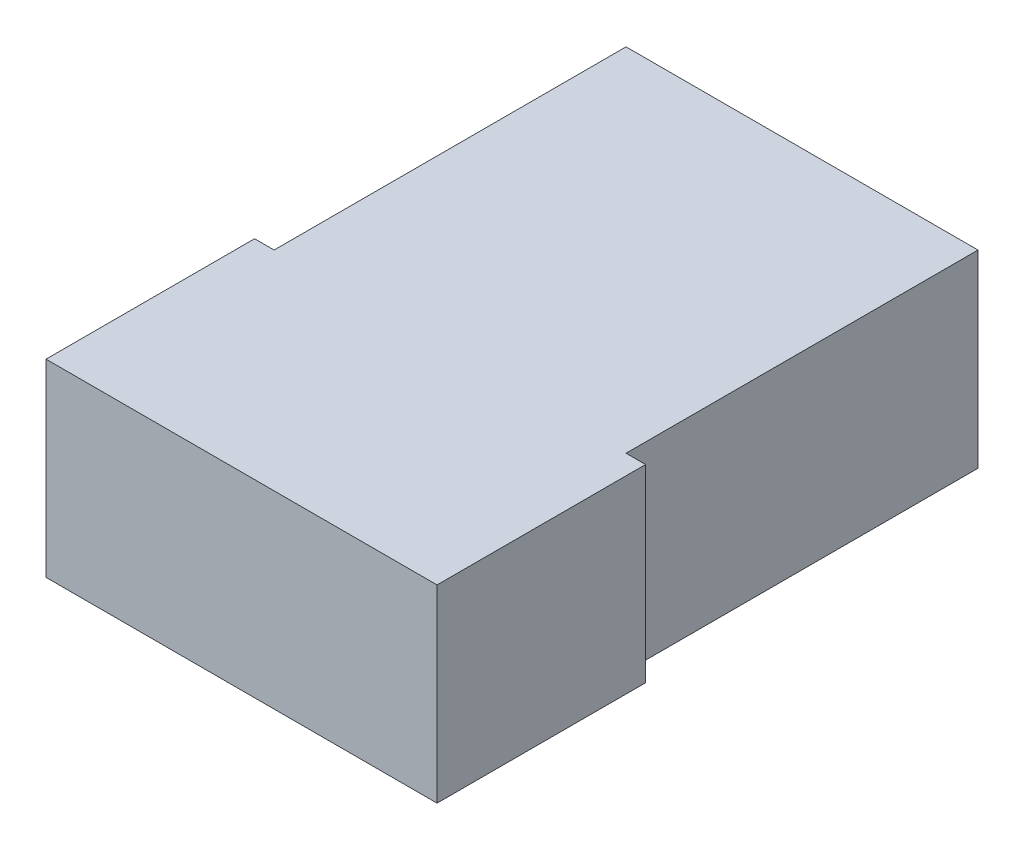
ISO-10303-21;
HEADER;
FILE_DESCRIPTION(('STEP AP214'),'2;1');
FILE_NAME('part.step','',(''),(''),'','','');
FILE_SCHEMA(('AUTOMOTIVE_DESIGN { 1 0 10303 214 1 1 1 1 }'));
ENDSEC;
DATA;
#1=APPLICATION_CONTEXT('core data for automotive mechanical design processes');
#2=APPLICATION_PROTOCOL_DEFINITION('international standard','automotive_design',2000,#1);
#3=PRODUCT_CONTEXT('',#1,'mechanical');
#4=PRODUCT('Part','Part','',(#3));
#5=PRODUCT_RELATED_PRODUCT_CATEGORY('part','',(#4));
#6=PRODUCT_DEFINITION_FORMATION('','',#4);
#7=PRODUCT_DEFINITION_CONTEXT('part definition',#1,'design');
#8=PRODUCT_DEFINITION('design','',#6,#7);
#9=PRODUCT_DEFINITION_SHAPE('','',#8);
#10=(LENGTH_UNIT() NAMED_UNIT(*) SI_UNIT(.MILLI.,.METRE.));
#11=(NAMED_UNIT(*) PLANE_ANGLE_UNIT() SI_UNIT($,.RADIAN.));
#12=(NAMED_UNIT(*) SI_UNIT($,.STERADIAN.) SOLID_ANGLE_UNIT());
#13=UNCERTAINTY_MEASURE_WITH_UNIT(LENGTH_MEASURE(1.E-05),#10,'distance_accuracy_value','');
#14=(GEOMETRIC_REPRESENTATION_CONTEXT(3) GLOBAL_UNCERTAINTY_ASSIGNED_CONTEXT((#13)) GLOBAL_UNIT_ASSIGNED_CONTEXT((#10,
#11,#12)) REPRESENTATION_CONTEXT('',''));
#15=CARTESIAN_POINT('',(0.,0.,0.));
#16=DIRECTION('',(0.,0.,1.));
#17=DIRECTION('',(1.,0.,0.));
#18=AXIS2_PLACEMENT_3D('',#15,#16,#17);
#19=CARTESIAN_POINT('',(0.,48.,0.));
#20=DIRECTION('',(0.,-1.,0.));
#21=DIRECTION('',(0.,0.,-1.));
#22=AXIS2_PLACEMENT_3D('',#19,#20,#21);
#23=PLANE('',#22);
#24=DIRECTION('',(0.,0.,-1.));
#25=VECTOR('',#24,1.);
#26=CARTESIAN_POINT('',(13.5,48.,13.5));
#27=LINE('',#26,#25);
#28=CARTESIAN_POINT('',(13.5,48.,13.5));
#29=VERTEX_POINT('',#28);
#30=CARTESIAN_POINT('',(13.5,48.,-13.5));
#31=VERTEX_POINT('',#30);
#32=EDGE_CURVE('E297',#29,#31,#27,.T.);
#33=ORIENTED_EDGE('',*,*,#32,.F.);
#34=DIRECTION('',(-1.,0.,0.));
#35=VECTOR('',#34,1.);
#36=CARTESIAN_POINT('',(15.,48.,13.5));
#37=LINE('',#36,#35);
#38=CARTESIAN_POINT('',(15.,48.,13.5));
#39=VERTEX_POINT('',#38);
#40=EDGE_CURVE('E272',#39,#29,#37,.T.);
#41=ORIENTED_EDGE('',*,*,#40,.F.);
#42=DIRECTION('',(0.,0.,-1.));
#43=VECTOR('',#42,1.);
#44=CARTESIAN_POINT('',(15.,48.,29.5));
#45=LINE('',#44,#43);
#46=CARTESIAN_POINT('',(15.,48.,29.5));
#47=VERTEX_POINT('',#46);
#48=EDGE_CURVE('E281',#47,#39,#45,.T.);
#49=ORIENTED_EDGE('',*,*,#48,.F.);
#50=DIRECTION('',(1.,0.,0.));
#51=VECTOR('',#50,1.);
#52=CARTESIAN_POINT('',(-15.,48.,29.5));
#53=LINE('',#52,#51);
#54=CARTESIAN_POINT('',(-15.,48.,29.5));
#55=VERTEX_POINT('',#54);
#56=EDGE_CURVE('E285',#55,#47,#53,.T.);
#57=ORIENTED_EDGE('',*,*,#56,.F.);
#58=DIRECTION('',(0.,0.,1.));
#59=VECTOR('',#58,1.);
#60=CARTESIAN_POINT('',(-15.,48.,13.5));
#61=LINE('',#60,#59);
#62=CARTESIAN_POINT('',(-15.,48.,13.5));
#63=VERTEX_POINT('',#62);
#64=EDGE_CURVE('E267',#63,#55,#61,.T.);
#65=ORIENTED_EDGE('',*,*,#64,.F.);
#66=CARTESIAN_POINT('',(-13.5,48.,13.5));
#67=VERTEX_POINT('',#66);
#68=EDGE_CURVE('E287',#67,#63,#37,.T.);
#69=ORIENTED_EDGE('',*,*,#68,.F.);
#70=DIRECTION('',(0.,0.,1.));
#71=VECTOR('',#70,1.);
#72=CARTESIAN_POINT('',(-13.5,48.,13.5));
#73=LINE('',#72,#71);
#74=CARTESIAN_POINT('',(-13.5,48.,-13.5));
#75=VERTEX_POINT('',#74);
#76=EDGE_CURVE('E304',#75,#67,#73,.T.);
#77=ORIENTED_EDGE('',*,*,#76,.F.);
#78=DIRECTION('',(-1.,0.,0.));
#79=VECTOR('',#78,1.);
#80=CARTESIAN_POINT('',(-13.5,48.,-13.5));
#81=LINE('',#80,#79);
#82=EDGE_CURVE('E315',#31,#75,#81,.T.);
#83=ORIENTED_EDGE('',*,*,#82,.F.);
#84=EDGE_LOOP('',(#33,#41,#49,#57,#65,#69,#77,#83));
#85=FACE_BOUND('',#84,.T.);
#86=DIRECTION('',(-1.,0.,0.));
#87=VECTOR('',#86,1.);
#88=CARTESIAN_POINT('',(11.7,48.,-11.7));
#89=LINE('',#88,#87);
#90=CARTESIAN_POINT('',(11.7,48.,-11.7));
#91=VERTEX_POINT('',#90);
#92=CARTESIAN_POINT('',(-11.7,48.,-11.7));
#93=VERTEX_POINT('',#92);
#94=EDGE_CURVE('E239',#91,#93,#89,.T.);
#95=ORIENTED_EDGE('',*,*,#94,.T.);
#96=DIRECTION('',(0.,0.,1.));
#97=VECTOR('',#96,1.);
#98=CARTESIAN_POINT('',(-11.7,48.,-11.7));
#99=LINE('',#98,#97);
#100=CARTESIAN_POINT('',(-11.7,48.,11.7));
#101=VERTEX_POINT('',#100);
#102=EDGE_CURVE('E232',#93,#101,#99,.T.);
#103=ORIENTED_EDGE('',*,*,#102,.T.);
#104=DIRECTION('',(1.,0.,0.));
#105=VECTOR('',#104,1.);
#106=CARTESIAN_POINT('',(-11.7,48.,11.7));
#107=LINE('',#106,#105);
#108=CARTESIAN_POINT('',(11.7,48.,11.7));
#109=VERTEX_POINT('',#108);
#110=EDGE_CURVE('E248',#101,#109,#107,.T.);
#111=ORIENTED_EDGE('',*,*,#110,.T.);
#112=DIRECTION('',(0.,0.,-1.));
#113=VECTOR('',#112,1.);
#114=CARTESIAN_POINT('',(11.7,48.,11.7));
#115=LINE('',#114,#113);
#116=EDGE_CURVE('E255',#109,#91,#115,.T.);
#117=ORIENTED_EDGE('',*,*,#116,.T.);
#118=EDGE_LOOP('',(#95,#103,#111,#117));
#119=FACE_BOUND('',#118,.T.);
#120=DIRECTION('',(1.,0.,0.));
#121=VECTOR('',#120,1.);
#122=CARTESIAN_POINT('',(-13.7,48.,28.7));
#123=LINE('',#122,#121);
#124=CARTESIAN_POINT('',(-13.7,48.,28.7));
#125=VERTEX_POINT('',#124);
#126=CARTESIAN_POINT('',(13.7,48.,28.7));
#127=VERTEX_POINT('',#126);
#128=EDGE_CURVE('E197',#125,#127,#123,.T.);
#129=ORIENTED_EDGE('',*,*,#128,.T.);
#130=DIRECTION('',(0.,0.,-1.));
#131=VECTOR('',#130,1.);
#132=CARTESIAN_POINT('',(13.7,48.,28.7));
#133=LINE('',#132,#131);
#134=CARTESIAN_POINT('',(13.7,48.,14.3));
#135=VERTEX_POINT('',#134);
#136=EDGE_CURVE('E59',#127,#135,#133,.T.);
#137=ORIENTED_EDGE('',*,*,#136,.T.);
#138=DIRECTION('',(-1.,0.,0.));
#139=VECTOR('',#138,1.);
#140=CARTESIAN_POINT('',(-13.7,48.,14.3));
#141=LINE('',#140,#139);
#142=CARTESIAN_POINT('',(-13.7,48.,14.3));
#143=VERTEX_POINT('',#142);
#144=EDGE_CURVE('E198',#135,#143,#141,.T.);
#145=ORIENTED_EDGE('',*,*,#144,.T.);
#146=DIRECTION('',(0.,0.,1.));
#147=VECTOR('',#146,1.);
#148=CARTESIAN_POINT('',(-13.7,48.,28.7));
#149=LINE('',#148,#147);
#150=EDGE_CURVE('E578',#143,#125,#149,.T.);
#151=ORIENTED_EDGE('',*,*,#150,.T.);
#152=EDGE_LOOP('',(#129,#137,#145,#151));
#153=FACE_BOUND('',#152,.T.);
#154=ADVANCED_FACE('F43',(#85,#119,#153),#23,.T.);
#155=CARTESIAN_POINT('',(13.5,62.5,13.5));
#156=DIRECTION('',(-1.,0.,0.));
#157=DIRECTION('',(0.,0.,1.));
#158=AXIS2_PLACEMENT_3D('',#155,#156,#157);
#159=PLANE('',#158);
#160=ORIENTED_EDGE('',*,*,#32,.T.);
#161=DIRECTION('',(0.,-1.,0.));
#162=VECTOR('',#161,1.);
#163=CARTESIAN_POINT('',(13.5,62.5,-13.5));
#164=LINE('',#163,#162);
#165=CARTESIAN_POINT('',(13.5,62.5,-13.5));
#166=VERTEX_POINT('',#165);
#167=EDGE_CURVE('E11',#166,#31,#164,.T.);
#168=ORIENTED_EDGE('',*,*,#167,.F.);
#169=DIRECTION('',(0.,0.,-1.));
#170=VECTOR('',#169,1.);
#171=CARTESIAN_POINT('',(13.5,62.5,13.5));
#172=LINE('',#171,#170);
#173=CARTESIAN_POINT('',(13.5,62.5,13.5));
#174=VERTEX_POINT('',#173);
#175=EDGE_CURVE('E301',#174,#166,#172,.T.);
#176=ORIENTED_EDGE('',*,*,#175,.F.);
#177=DIRECTION('',(0.,-1.,0.));
#178=VECTOR('',#177,1.);
#179=CARTESIAN_POINT('',(13.5,62.5,13.5));
#180=LINE('',#179,#178);
#181=EDGE_CURVE('E307',#174,#29,#180,.T.);
#182=ORIENTED_EDGE('',*,*,#181,.T.);
#183=EDGE_LOOP('',(#160,#168,#176,#182));
#184=FACE_BOUND('',#183,.T.);
#185=ADVANCED_FACE('F44',(#184),#159,.F.);
#186=CARTESIAN_POINT('',(-13.5,62.5,-13.5));
#187=DIRECTION('',(0.,0.,1.));
#188=DIRECTION('',(1.,0.,0.));
#189=AXIS2_PLACEMENT_3D('',#186,#187,#188);
#190=PLANE('',#189);
#191=ORIENTED_EDGE('',*,*,#82,.T.);
#192=DIRECTION('',(0.,-1.,0.));
#193=VECTOR('',#192,1.);
#194=CARTESIAN_POINT('',(-13.5,62.5,-13.5));
#195=LINE('',#194,#193);
#196=CARTESIAN_POINT('',(-13.5,62.5,-13.5));
#197=VERTEX_POINT('',#196);
#198=EDGE_CURVE('E51',#197,#75,#195,.T.);
#199=ORIENTED_EDGE('',*,*,#198,.F.);
#200=DIRECTION('',(-1.,0.,0.));
#201=VECTOR('',#200,1.);
#202=CARTESIAN_POINT('',(-13.5,62.5,-13.5));
#203=LINE('',#202,#201);
#204=EDGE_CURVE('E302',#166,#197,#203,.T.);
#205=ORIENTED_EDGE('',*,*,#204,.F.);
#206=ORIENTED_EDGE('',*,*,#167,.T.);
#207=EDGE_LOOP('',(#191,#199,#205,#206));
#208=FACE_BOUND('',#207,.T.);
#209=ADVANCED_FACE('F344',(#208),#190,.F.);
#210=CARTESIAN_POINT('',(-13.5,62.5,13.5));
#211=DIRECTION('',(1.,0.,0.));
#212=DIRECTION('',(0.,0.,-1.));
#213=AXIS2_PLACEMENT_3D('',#210,#211,#212);
#214=PLANE('',#213);
#215=ORIENTED_EDGE('',*,*,#76,.T.);
#216=DIRECTION('',(0.,-1.,0.));
#217=VECTOR('',#216,1.);
#218=CARTESIAN_POINT('',(-13.5,62.5,13.5));
#219=LINE('',#218,#217);
#220=CARTESIAN_POINT('',(-13.5,62.5,13.5));
#221=VERTEX_POINT('',#220);
#222=EDGE_CURVE('E317',#221,#67,#219,.T.);
#223=ORIENTED_EDGE('',*,*,#222,.F.);
#224=DIRECTION('',(0.,0.,1.));
#225=VECTOR('',#224,1.);
#226=CARTESIAN_POINT('',(-13.5,62.5,13.5));
#227=LINE('',#226,#225);
#228=EDGE_CURVE('E310',#197,#221,#227,.T.);
#229=ORIENTED_EDGE('',*,*,#228,.F.);
#230=ORIENTED_EDGE('',*,*,#198,.T.);
#231=EDGE_LOOP('',(#215,#223,#229,#230));
#232=FACE_BOUND('',#231,.T.);
#233=ADVANCED_FACE('F324',(#232),#214,.F.);
#234=CARTESIAN_POINT('',(0.,62.5,0.));
#235=DIRECTION('',(0.,-1.,0.));
#236=DIRECTION('',(0.,0.,-1.));
#237=AXIS2_PLACEMENT_3D('',#234,#235,#236);
#238=PLANE('',#237);
#239=ORIENTED_EDGE('',*,*,#175,.T.);
#240=ORIENTED_EDGE('',*,*,#204,.T.);
#241=ORIENTED_EDGE('',*,*,#228,.T.);
#242=DIRECTION('',(-1.,0.,0.));
#243=VECTOR('',#242,1.);
#244=CARTESIAN_POINT('',(15.,62.5,13.5));
#245=LINE('',#244,#243);
#246=CARTESIAN_POINT('',(-15.,62.5,13.5));
#247=VERTEX_POINT('',#246);
#248=EDGE_CURVE('E273',#221,#247,#245,.T.);
#249=ORIENTED_EDGE('',*,*,#248,.T.);
#250=DIRECTION('',(0.,0.,1.));
#251=VECTOR('',#250,1.);
#252=CARTESIAN_POINT('',(-15.,62.5,13.5));
#253=LINE('',#252,#251);
#254=CARTESIAN_POINT('',(-15.,62.5,29.5));
#255=VERTEX_POINT('',#254);
#256=EDGE_CURVE('E270',#247,#255,#253,.T.);
#257=ORIENTED_EDGE('',*,*,#256,.T.);
#258=DIRECTION('',(1.,0.,0.));
#259=VECTOR('',#258,1.);
#260=CARTESIAN_POINT('',(-15.,62.5,29.5));
#261=LINE('',#260,#259);
#262=CARTESIAN_POINT('',(15.,62.5,29.5));
#263=VERTEX_POINT('',#262);
#264=EDGE_CURVE('E266',#255,#263,#261,.T.);
#265=ORIENTED_EDGE('',*,*,#264,.T.);
#266=DIRECTION('',(0.,0.,-1.));
#267=VECTOR('',#266,1.);
#268=CARTESIAN_POINT('',(15.,62.5,29.5));
#269=LINE('',#268,#267);
#270=CARTESIAN_POINT('',(15.,62.5,13.5));
#271=VERTEX_POINT('',#270);
#272=EDGE_CURVE('E271',#263,#271,#269,.T.);
#273=ORIENTED_EDGE('',*,*,#272,.T.);
#274=EDGE_CURVE('E277',#271,#174,#245,.T.);
#275=ORIENTED_EDGE('',*,*,#274,.T.);
#276=EDGE_LOOP('',(#239,#240,#241,#249,#257,#265,#273,#275));
#277=FACE_BOUND('',#276,.T.);
#278=ADVANCED_FACE('F338',(#277),#238,.F.);
#279=CARTESIAN_POINT('',(15.,62.5,13.5));
#280=DIRECTION('',(0.,0.,1.));
#281=DIRECTION('',(1.,0.,0.));
#282=AXIS2_PLACEMENT_3D('',#279,#280,#281);
#283=PLANE('',#282);
#284=ORIENTED_EDGE('',*,*,#248,.F.);
#285=ORIENTED_EDGE('',*,*,#222,.T.);
#286=ORIENTED_EDGE('',*,*,#68,.T.);
#287=DIRECTION('',(0.,-1.,0.));
#288=VECTOR('',#287,1.);
#289=CARTESIAN_POINT('',(-15.,62.5,13.5));
#290=LINE('',#289,#288);
#291=EDGE_CURVE('E276',#247,#63,#290,.T.);
#292=ORIENTED_EDGE('',*,*,#291,.F.);
#293=EDGE_LOOP('',(#284,#285,#286,#292));
#294=FACE_BOUND('',#293,.T.);
#295=ADVANCED_FACE('F334',(#294),#283,.F.);
#296=CARTESIAN_POINT('',(-15.,62.5,13.5));
#297=DIRECTION('',(1.,0.,0.));
#298=DIRECTION('',(0.,0.,-1.));
#299=AXIS2_PLACEMENT_3D('',#296,#297,#298);
#300=PLANE('',#299);
#301=ORIENTED_EDGE('',*,*,#64,.T.);
#302=DIRECTION('',(0.,-1.,0.));
#303=VECTOR('',#302,1.);
#304=CARTESIAN_POINT('',(-15.,62.5,29.5));
#305=LINE('',#304,#303);
#306=EDGE_CURVE('E300',#255,#55,#305,.T.);
#307=ORIENTED_EDGE('',*,*,#306,.F.);
#308=ORIENTED_EDGE('',*,*,#256,.F.);
#309=ORIENTED_EDGE('',*,*,#291,.T.);
#310=EDGE_LOOP('',(#301,#307,#308,#309));
#311=FACE_BOUND('',#310,.T.);
#312=ADVANCED_FACE('F340',(#311),#300,.F.);
#313=CARTESIAN_POINT('',(-15.,62.5,29.5));
#314=DIRECTION('',(0.,0.,-1.));
#315=DIRECTION('',(-1.,0.,0.));
#316=AXIS2_PLACEMENT_3D('',#313,#314,#315);
#317=PLANE('',#316);
#318=ORIENTED_EDGE('',*,*,#56,.T.);
#319=DIRECTION('',(0.,-1.,0.));
#320=VECTOR('',#319,1.);
#321=CARTESIAN_POINT('',(15.,62.5,29.5));
#322=LINE('',#321,#320);
#323=EDGE_CURVE('E295',#263,#47,#322,.T.);
#324=ORIENTED_EDGE('',*,*,#323,.F.);
#325=ORIENTED_EDGE('',*,*,#264,.F.);
#326=ORIENTED_EDGE('',*,*,#306,.T.);
#327=EDGE_LOOP('',(#318,#324,#325,#326));
#328=FACE_BOUND('',#327,.T.);
#329=ADVANCED_FACE('F358',(#328),#317,.F.);
#330=CARTESIAN_POINT('',(15.,62.5,29.5));
#331=DIRECTION('',(-1.,0.,0.));
#332=DIRECTION('',(0.,0.,1.));
#333=AXIS2_PLACEMENT_3D('',#330,#331,#332);
#334=PLANE('',#333);
#335=ORIENTED_EDGE('',*,*,#48,.T.);
#336=DIRECTION('',(0.,-1.,0.));
#337=VECTOR('',#336,1.);
#338=CARTESIAN_POINT('',(15.,62.5,13.5));
#339=LINE('',#338,#337);
#340=EDGE_CURVE('E293',#271,#39,#339,.T.);
#341=ORIENTED_EDGE('',*,*,#340,.F.);
#342=ORIENTED_EDGE('',*,*,#272,.F.);
#343=ORIENTED_EDGE('',*,*,#323,.T.);
#344=EDGE_LOOP('',(#335,#341,#342,#343));
#345=FACE_BOUND('',#344,.T.);
#346=ADVANCED_FACE('F354',(#345),#334,.F.);
#347=ORIENTED_EDGE('',*,*,#181,.F.);
#348=ORIENTED_EDGE('',*,*,#274,.F.);
#349=ORIENTED_EDGE('',*,*,#340,.T.);
#350=ORIENTED_EDGE('',*,*,#40,.T.);
#351=EDGE_LOOP('',(#347,#348,#349,#350));
#352=FACE_BOUND('',#351,.T.);
#353=ADVANCED_FACE('F346',(#352),#283,.F.);
#354=CARTESIAN_POINT('',(-11.7,54.,-11.7));
#355=DIRECTION('',(1.,0.,0.));
#356=DIRECTION('',(0.,0.,-1.));
#357=AXIS2_PLACEMENT_3D('',#354,#355,#356);
#358=PLANE('',#357);
#359=ORIENTED_EDGE('',*,*,#102,.F.);
#360=DIRECTION('',(0.,-1.,0.));
#361=VECTOR('',#360,1.);
#362=CARTESIAN_POINT('',(-11.7,54.,-11.7));
#363=LINE('',#362,#361);
#364=CARTESIAN_POINT('',(-11.7,54.,-11.7));
#365=VERTEX_POINT('',#364);
#366=EDGE_CURVE('E246',#365,#93,#363,.T.);
#367=ORIENTED_EDGE('',*,*,#366,.F.);
#368=DIRECTION('',(0.,0.,1.));
#369=VECTOR('',#368,1.);
#370=CARTESIAN_POINT('',(-11.7,54.,-11.7));
#371=LINE('',#370,#369);
#372=CARTESIAN_POINT('',(-11.7,54.,11.7));
#373=VERTEX_POINT('',#372);
#374=EDGE_CURVE('E236',#365,#373,#371,.T.);
#375=ORIENTED_EDGE('',*,*,#374,.T.);
#376=DIRECTION('',(0.,-1.,0.));
#377=VECTOR('',#376,1.);
#378=CARTESIAN_POINT('',(-11.7,54.,11.7));
#379=LINE('',#378,#377);
#380=EDGE_CURVE('E264',#373,#101,#379,.T.);
#381=ORIENTED_EDGE('',*,*,#380,.T.);
#382=EDGE_LOOP('',(#359,#367,#375,#381));
#383=FACE_BOUND('',#382,.T.);
#384=ADVANCED_FACE('F428',(#383),#358,.T.);
#385=CARTESIAN_POINT('',(-11.7,54.,11.7));
#386=DIRECTION('',(0.,0.,-1.));
#387=DIRECTION('',(-1.,0.,0.));
#388=AXIS2_PLACEMENT_3D('',#385,#386,#387);
#389=PLANE('',#388);
#390=ORIENTED_EDGE('',*,*,#110,.F.);
#391=ORIENTED_EDGE('',*,*,#380,.F.);
#392=DIRECTION('',(1.,0.,0.));
#393=VECTOR('',#392,1.);
#394=CARTESIAN_POINT('',(-11.7,54.,11.7));
#395=LINE('',#394,#393);
#396=CARTESIAN_POINT('',(11.7,54.,11.7));
#397=VERTEX_POINT('',#396);
#398=EDGE_CURVE('E237',#373,#397,#395,.T.);
#399=ORIENTED_EDGE('',*,*,#398,.T.);
#400=DIRECTION('',(0.,-1.,0.));
#401=VECTOR('',#400,1.);
#402=CARTESIAN_POINT('',(11.7,54.,11.7));
#403=LINE('',#402,#401);
#404=EDGE_CURVE('E262',#397,#109,#403,.T.);
#405=ORIENTED_EDGE('',*,*,#404,.T.);
#406=EDGE_LOOP('',(#390,#391,#399,#405));
#407=FACE_BOUND('',#406,.T.);
#408=ADVANCED_FACE('F432',(#407),#389,.T.);
#409=CARTESIAN_POINT('',(11.7,54.,11.7));
#410=DIRECTION('',(-1.,0.,0.));
#411=DIRECTION('',(0.,0.,1.));
#412=AXIS2_PLACEMENT_3D('',#409,#410,#411);
#413=PLANE('',#412);
#414=ORIENTED_EDGE('',*,*,#116,.F.);
#415=ORIENTED_EDGE('',*,*,#404,.F.);
#416=DIRECTION('',(0.,0.,-1.));
#417=VECTOR('',#416,1.);
#418=CARTESIAN_POINT('',(11.7,54.,11.7));
#419=LINE('',#418,#417);
#420=CARTESIAN_POINT('',(11.7,54.,-11.7));
#421=VERTEX_POINT('',#420);
#422=EDGE_CURVE('E245',#397,#421,#419,.T.);
#423=ORIENTED_EDGE('',*,*,#422,.T.);
#424=DIRECTION('',(0.,-1.,0.));
#425=VECTOR('',#424,1.);
#426=CARTESIAN_POINT('',(11.7,54.,-11.7));
#427=LINE('',#426,#425);
#428=EDGE_CURVE('E256',#421,#91,#427,.T.);
#429=ORIENTED_EDGE('',*,*,#428,.T.);
#430=EDGE_LOOP('',(#414,#415,#423,#429));
#431=FACE_BOUND('',#430,.T.);
#432=ADVANCED_FACE('F443',(#431),#413,.T.);
#433=CARTESIAN_POINT('',(11.7,54.,-11.7));
#434=DIRECTION('',(0.,0.,1.));
#435=DIRECTION('',(1.,0.,0.));
#436=AXIS2_PLACEMENT_3D('',#433,#434,#435);
#437=PLANE('',#436);
#438=ORIENTED_EDGE('',*,*,#94,.F.);
#439=ORIENTED_EDGE('',*,*,#428,.F.);
#440=DIRECTION('',(-1.,0.,0.));
#441=VECTOR('',#440,1.);
#442=CARTESIAN_POINT('',(11.7,54.,-11.7));
#443=LINE('',#442,#441);
#444=EDGE_CURVE('E242',#421,#365,#443,.T.);
#445=ORIENTED_EDGE('',*,*,#444,.T.);
#446=ORIENTED_EDGE('',*,*,#366,.T.);
#447=EDGE_LOOP('',(#438,#439,#445,#446));
#448=FACE_BOUND('',#447,.T.);
#449=ADVANCED_FACE('F451',(#448),#437,.T.);
#450=CARTESIAN_POINT('',(0.,54.,0.));
#451=DIRECTION('',(0.,1.,0.));
#452=DIRECTION('',(0.,0.,1.));
#453=AXIS2_PLACEMENT_3D('',#450,#451,#452);
#454=PLANE('',#453);
#455=DIRECTION('',(-1.,0.,0.));
#456=VECTOR('',#455,1.);
#457=CARTESIAN_POINT('',(7.5,54.,-7.5));
#458=LINE('',#457,#456);
#459=CARTESIAN_POINT('',(7.5,54.,-7.5));
#460=VERTEX_POINT('',#459);
#461=CARTESIAN_POINT('',(-7.5,54.,-7.5));
#462=VERTEX_POINT('',#461);
#463=EDGE_CURVE('E213',#460,#462,#458,.T.);
#464=ORIENTED_EDGE('',*,*,#463,.T.);
#465=DIRECTION('',(0.,0.,1.));
#466=VECTOR('',#465,1.);
#467=CARTESIAN_POINT('',(-7.5,54.,-7.5));
#468=LINE('',#467,#466);
#469=CARTESIAN_POINT('',(-7.5,54.,7.5));
#470=VERTEX_POINT('',#469);
#471=EDGE_CURVE('E202',#462,#470,#468,.T.);
#472=ORIENTED_EDGE('',*,*,#471,.T.);
#473=DIRECTION('',(1.,0.,0.));
#474=VECTOR('',#473,1.);
#475=CARTESIAN_POINT('',(-7.5,54.,7.5));
#476=LINE('',#475,#474);
#477=CARTESIAN_POINT('',(7.5,54.,7.5));
#478=VERTEX_POINT('',#477);
#479=EDGE_CURVE('E201',#470,#478,#476,.T.);
#480=ORIENTED_EDGE('',*,*,#479,.T.);
#481=DIRECTION('',(0.,0.,-1.));
#482=VECTOR('',#481,1.);
#483=CARTESIAN_POINT('',(7.5,54.,7.5));
#484=LINE('',#483,#482);
#485=EDGE_CURVE('E67',#478,#460,#484,.T.);
#486=ORIENTED_EDGE('',*,*,#485,.T.);
#487=EDGE_LOOP('',(#464,#472,#480,#486));
#488=FACE_BOUND('',#487,.T.);
#489=ORIENTED_EDGE('',*,*,#374,.F.);
#490=ORIENTED_EDGE('',*,*,#444,.F.);
#491=ORIENTED_EDGE('',*,*,#422,.F.);
#492=ORIENTED_EDGE('',*,*,#398,.F.);
#493=EDGE_LOOP('',(#489,#490,#491,#492));
#494=FACE_BOUND('',#493,.T.);
#495=ADVANCED_FACE('F464',(#488,#494),#454,.F.);
#496=CARTESIAN_POINT('',(-7.5,59.5,-7.5));
#497=DIRECTION('',(1.,0.,0.));
#498=DIRECTION('',(0.,0.,-1.));
#499=AXIS2_PLACEMENT_3D('',#496,#497,#498);
#500=PLANE('',#499);
#501=ORIENTED_EDGE('',*,*,#471,.F.);
#502=DIRECTION('',(0.,-1.,0.));
#503=VECTOR('',#502,1.);
#504=CARTESIAN_POINT('',(-7.5,59.5,-7.5));
#505=LINE('',#504,#503);
#506=CARTESIAN_POINT('',(-7.5,59.5,-7.5));
#507=VERTEX_POINT('',#506);
#508=EDGE_CURVE('E218',#507,#462,#505,.T.);
#509=ORIENTED_EDGE('',*,*,#508,.F.);
#510=DIRECTION('',(0.,0.,1.));
#511=VECTOR('',#510,1.);
#512=CARTESIAN_POINT('',(-7.5,59.5,-7.5));
#513=LINE('',#512,#511);
#514=CARTESIAN_POINT('',(-7.5,59.5,7.5));
#515=VERTEX_POINT('',#514);
#516=EDGE_CURVE('E212',#507,#515,#513,.T.);
#517=ORIENTED_EDGE('',*,*,#516,.T.);
#518=DIRECTION('',(0.,-1.,0.));
#519=VECTOR('',#518,1.);
#520=CARTESIAN_POINT('',(-7.5,59.5,7.5));
#521=LINE('',#520,#519);
#522=EDGE_CURVE('E235',#515,#470,#521,.T.);
#523=ORIENTED_EDGE('',*,*,#522,.T.);
#524=EDGE_LOOP('',(#501,#509,#517,#523));
#525=FACE_BOUND('',#524,.T.);
#526=ADVANCED_FACE('F471',(#525),#500,.T.);
#527=CARTESIAN_POINT('',(-7.5,59.5,7.5));
#528=DIRECTION('',(0.,0.,-1.));
#529=DIRECTION('',(-1.,0.,0.));
#530=AXIS2_PLACEMENT_3D('',#527,#528,#529);
#531=PLANE('',#530);
#532=ORIENTED_EDGE('',*,*,#479,.F.);
#533=ORIENTED_EDGE('',*,*,#522,.F.);
#534=DIRECTION('',(1.,0.,0.));
#535=VECTOR('',#534,1.);
#536=CARTESIAN_POINT('',(-7.5,59.5,7.5));
#537=LINE('',#536,#535);
#538=CARTESIAN_POINT('',(7.5,59.5,7.5));
#539=VERTEX_POINT('',#538);
#540=EDGE_CURVE('E211',#515,#539,#537,.T.);
#541=ORIENTED_EDGE('',*,*,#540,.T.);
#542=DIRECTION('',(0.,-1.,0.));
#543=VECTOR('',#542,1.);
#544=CARTESIAN_POINT('',(7.5,59.5,7.5));
#545=LINE('',#544,#543);
#546=EDGE_CURVE('E229',#539,#478,#545,.T.);
#547=ORIENTED_EDGE('',*,*,#546,.T.);
#548=EDGE_LOOP('',(#532,#533,#541,#547));
#549=FACE_BOUND('',#548,.T.);
#550=ADVANCED_FACE('F484',(#549),#531,.T.);
#551=CARTESIAN_POINT('',(7.5,59.5,7.5));
#552=DIRECTION('',(-1.,0.,0.));
#553=DIRECTION('',(0.,0.,1.));
#554=AXIS2_PLACEMENT_3D('',#551,#552,#553);
#555=PLANE('',#554);
#556=ORIENTED_EDGE('',*,*,#485,.F.);
#557=ORIENTED_EDGE('',*,*,#546,.F.);
#558=DIRECTION('',(0.,0.,-1.));
#559=VECTOR('',#558,1.);
#560=CARTESIAN_POINT('',(7.5,59.5,7.5));
#561=LINE('',#560,#559);
#562=CARTESIAN_POINT('',(7.5,59.5,-7.5));
#563=VERTEX_POINT('',#562);
#564=EDGE_CURVE('E220',#539,#563,#561,.T.);
#565=ORIENTED_EDGE('',*,*,#564,.T.);
#566=DIRECTION('',(0.,-1.,0.));
#567=VECTOR('',#566,1.);
#568=CARTESIAN_POINT('',(7.5,59.5,-7.5));
#569=LINE('',#568,#567);
#570=EDGE_CURVE('E226',#563,#460,#569,.T.);
#571=ORIENTED_EDGE('',*,*,#570,.T.);
#572=EDGE_LOOP('',(#556,#557,#565,#571));
#573=FACE_BOUND('',#572,.T.);
#574=ADVANCED_FACE('F494',(#573),#555,.T.);
#575=CARTESIAN_POINT('',(7.5,59.5,-7.5));
#576=DIRECTION('',(0.,0.,1.));
#577=DIRECTION('',(1.,0.,0.));
#578=AXIS2_PLACEMENT_3D('',#575,#576,#577);
#579=PLANE('',#578);
#580=ORIENTED_EDGE('',*,*,#463,.F.);
#581=ORIENTED_EDGE('',*,*,#570,.F.);
#582=DIRECTION('',(-1.,0.,0.));
#583=VECTOR('',#582,1.);
#584=CARTESIAN_POINT('',(7.5,59.5,-7.5));
#585=LINE('',#584,#583);
#586=EDGE_CURVE('E216',#563,#507,#585,.T.);
#587=ORIENTED_EDGE('',*,*,#586,.T.);
#588=ORIENTED_EDGE('',*,*,#508,.T.);
#589=EDGE_LOOP('',(#580,#581,#587,#588));
#590=FACE_BOUND('',#589,.T.);
#591=ADVANCED_FACE('F502',(#590),#579,.T.);
#592=CARTESIAN_POINT('',(0.,59.5,0.));
#593=DIRECTION('',(0.,1.,0.));
#594=DIRECTION('',(0.,0.,1.));
#595=AXIS2_PLACEMENT_3D('',#592,#593,#594);
#596=PLANE('',#595);
#597=ORIENTED_EDGE('',*,*,#516,.F.);
#598=ORIENTED_EDGE('',*,*,#586,.F.);
#599=ORIENTED_EDGE('',*,*,#564,.F.);
#600=ORIENTED_EDGE('',*,*,#540,.F.);
#601=EDGE_LOOP('',(#597,#598,#599,#600));
#602=FACE_BOUND('',#601,.T.);
#603=ADVANCED_FACE('F514',(#602),#596,.F.);
#604=CARTESIAN_POINT('',(13.7,56.2,28.7));
#605=DIRECTION('',(-1.,0.,0.));
#606=DIRECTION('',(0.,0.,1.));
#607=AXIS2_PLACEMENT_3D('',#604,#605,#606);
#608=PLANE('',#607);
#609=ORIENTED_EDGE('',*,*,#136,.F.);
#610=DIRECTION('',(0.,-1.,0.));
#611=VECTOR('',#610,1.);
#612=CARTESIAN_POINT('',(13.7,56.2,28.7));
#613=LINE('',#612,#611);
#614=CARTESIAN_POINT('',(13.7,56.2,28.7));
#615=VERTEX_POINT('',#614);
#616=EDGE_CURVE('E193',#615,#127,#613,.T.);
#617=ORIENTED_EDGE('',*,*,#616,.F.);
#618=DIRECTION('',(0.,0.,-1.));
#619=VECTOR('',#618,1.);
#620=CARTESIAN_POINT('',(13.7,56.2,28.7));
#621=LINE('',#620,#619);
#622=CARTESIAN_POINT('',(13.7,56.2,14.3));
#623=VERTEX_POINT('',#622);
#624=EDGE_CURVE('E190',#615,#623,#621,.T.);
#625=ORIENTED_EDGE('',*,*,#624,.T.);
#626=DIRECTION('',(0.,-1.,0.));
#627=VECTOR('',#626,1.);
#628=CARTESIAN_POINT('',(13.7,56.2,14.3));
#629=LINE('',#628,#627);
#630=EDGE_CURVE('E191',#623,#135,#629,.T.);
#631=ORIENTED_EDGE('',*,*,#630,.T.);
#632=EDGE_LOOP('',(#609,#617,#625,#631));
#633=FACE_BOUND('',#632,.T.);
#634=ADVANCED_FACE('F194',(#633),#608,.T.);
#635=CARTESIAN_POINT('',(-13.7,56.2,14.3));
#636=DIRECTION('',(0.,0.,1.));
#637=DIRECTION('',(1.,0.,0.));
#638=AXIS2_PLACEMENT_3D('',#635,#636,#637);
#639=PLANE('',#638);
#640=ORIENTED_EDGE('',*,*,#144,.F.);
#641=ORIENTED_EDGE('',*,*,#630,.F.);
#642=DIRECTION('',(-1.,0.,0.));
#643=VECTOR('',#642,1.);
#644=CARTESIAN_POINT('',(-13.7,56.2,14.3));
#645=LINE('',#644,#643);
#646=CARTESIAN_POINT('',(-13.7,56.2,14.3));
#647=VERTEX_POINT('',#646);
#648=EDGE_CURVE('E182',#623,#647,#645,.T.);
#649=ORIENTED_EDGE('',*,*,#648,.T.);
#650=DIRECTION('',(0.,-1.,0.));
#651=VECTOR('',#650,1.);
#652=CARTESIAN_POINT('',(-13.7,56.2,14.3));
#653=LINE('',#652,#651);
#654=EDGE_CURVE('E205',#647,#143,#653,.T.);
#655=ORIENTED_EDGE('',*,*,#654,.T.);
#656=EDGE_LOOP('',(#640,#641,#649,#655));
#657=FACE_BOUND('',#656,.T.);
#658=ADVANCED_FACE('F199',(#657),#639,.T.);
#659=CARTESIAN_POINT('',(-13.7,56.2,28.7));
#660=DIRECTION('',(1.,0.,0.));
#661=DIRECTION('',(0.,0.,-1.));
#662=AXIS2_PLACEMENT_3D('',#659,#660,#661);
#663=PLANE('',#662);
#664=ORIENTED_EDGE('',*,*,#150,.F.);
#665=ORIENTED_EDGE('',*,*,#654,.F.);
#666=DIRECTION('',(0.,0.,1.));
#667=VECTOR('',#666,1.);
#668=CARTESIAN_POINT('',(-13.7,56.2,28.7));
#669=LINE('',#668,#667);
#670=CARTESIAN_POINT('',(-13.7,56.2,28.7));
#671=VERTEX_POINT('',#670);
#672=EDGE_CURVE('E189',#647,#671,#669,.T.);
#673=ORIENTED_EDGE('',*,*,#672,.T.);
#674=DIRECTION('',(0.,-1.,0.));
#675=VECTOR('',#674,1.);
#676=CARTESIAN_POINT('',(-13.7,56.2,28.7));
#677=LINE('',#676,#675);
#678=EDGE_CURVE('E210',#671,#125,#677,.T.);
#679=ORIENTED_EDGE('',*,*,#678,.T.);
#680=EDGE_LOOP('',(#664,#665,#673,#679));
#681=FACE_BOUND('',#680,.T.);
#682=ADVANCED_FACE('F543',(#681),#663,.T.);
#683=CARTESIAN_POINT('',(-13.7,56.2,28.7));
#684=DIRECTION('',(0.,0.,-1.));
#685=DIRECTION('',(-1.,0.,0.));
#686=AXIS2_PLACEMENT_3D('',#683,#684,#685);
#687=PLANE('',#686);
#688=ORIENTED_EDGE('',*,*,#128,.F.);
#689=ORIENTED_EDGE('',*,*,#678,.F.);
#690=DIRECTION('',(1.,0.,0.));
#691=VECTOR('',#690,1.);
#692=CARTESIAN_POINT('',(-13.7,56.2,28.7));
#693=LINE('',#692,#691);
#694=EDGE_CURVE('E590',#671,#615,#693,.T.);
#695=ORIENTED_EDGE('',*,*,#694,.T.);
#696=ORIENTED_EDGE('',*,*,#616,.T.);
#697=EDGE_LOOP('',(#688,#689,#695,#696));
#698=FACE_BOUND('',#697,.T.);
#699=ADVANCED_FACE('F555',(#698),#687,.T.);
#700=CARTESIAN_POINT('',(0.,56.2,0.));
#701=DIRECTION('',(0.,-1.,0.));
#702=DIRECTION('',(0.,0.,-1.));
#703=AXIS2_PLACEMENT_3D('',#700,#701,#702);
#704=PLANE('',#703);
#705=ORIENTED_EDGE('',*,*,#624,.F.);
#706=ORIENTED_EDGE('',*,*,#694,.F.);
#707=ORIENTED_EDGE('',*,*,#672,.F.);
#708=ORIENTED_EDGE('',*,*,#648,.F.);
#709=EDGE_LOOP('',(#705,#706,#707,#708));
#710=FACE_BOUND('',#709,.T.);
#711=ADVANCED_FACE('F184',(#710),#704,.T.);
#712=CLOSED_SHELL('',(#154,#185,#209,#233,#278,#295,#312,#329,#346,#353,#384,#408,#432,#449,
#495,#526,#550,#574,#591,#603,#634,#658,#682,#699,#711));
#713=MANIFOLD_SOLID_BREP('B2',#712);
#714=ADVANCED_BREP_SHAPE_REPRESENTATION('',(#18,#713),#14);
#715=SHAPE_DEFINITION_REPRESENTATION(#9,#714);
ENDSEC;
END-ISO-10303-21;
